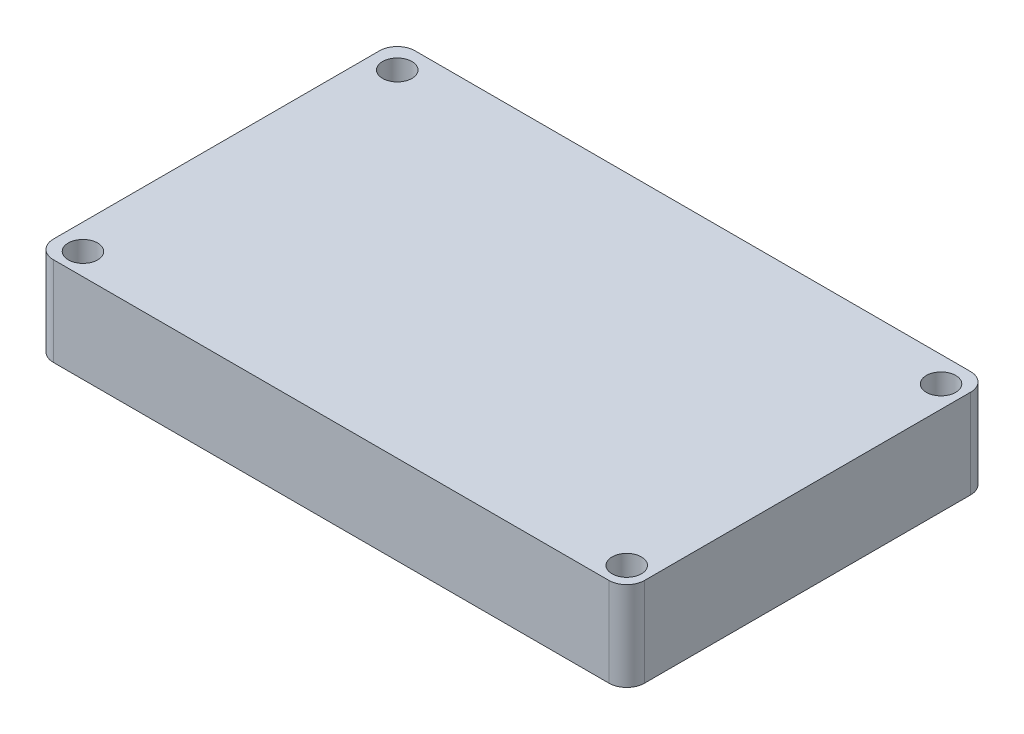
ISO-10303-21;
HEADER;
FILE_DESCRIPTION(('STEP AP214'),'2;1');
FILE_NAME('part.step','',(''),(''),'','','');
FILE_SCHEMA(('AUTOMOTIVE_DESIGN { 1 0 10303 214 1 1 1 1 }'));
ENDSEC;
DATA;
#1=APPLICATION_CONTEXT('core data for automotive mechanical design processes');
#2=APPLICATION_PROTOCOL_DEFINITION('international standard','automotive_design',2000,#1);
#3=PRODUCT_CONTEXT('',#1,'mechanical');
#4=PRODUCT('Part','Part','',(#3));
#5=PRODUCT_RELATED_PRODUCT_CATEGORY('part','',(#4));
#6=PRODUCT_DEFINITION_FORMATION('','',#4);
#7=PRODUCT_DEFINITION_CONTEXT('part definition',#1,'design');
#8=PRODUCT_DEFINITION('design','',#6,#7);
#9=PRODUCT_DEFINITION_SHAPE('','',#8);
#10=(LENGTH_UNIT() NAMED_UNIT(*) SI_UNIT(.MILLI.,.METRE.));
#11=(NAMED_UNIT(*) PLANE_ANGLE_UNIT() SI_UNIT($,.RADIAN.));
#12=(NAMED_UNIT(*) SI_UNIT($,.STERADIAN.) SOLID_ANGLE_UNIT());
#13=UNCERTAINTY_MEASURE_WITH_UNIT(LENGTH_MEASURE(1.E-05),#10,'distance_accuracy_value','');
#14=(GEOMETRIC_REPRESENTATION_CONTEXT(3) GLOBAL_UNCERTAINTY_ASSIGNED_CONTEXT((#13)) GLOBAL_UNIT_ASSIGNED_CONTEXT((#10,
#11,#12)) REPRESENTATION_CONTEXT('',''));
#15=CARTESIAN_POINT('',(0.,0.,0.));
#16=DIRECTION('',(0.,0.,1.));
#17=DIRECTION('',(1.,0.,0.));
#18=AXIS2_PLACEMENT_3D('',#15,#16,#17);
#19=CARTESIAN_POINT('',(0.,10.,0.));
#20=DIRECTION('',(1.,0.,0.));
#21=DIRECTION('',(0.,0.,-1.));
#22=AXIS2_PLACEMENT_3D('',#19,#20,#21);
#23=PLANE('',#22);
#24=DIRECTION('',(0.,0.,1.));
#25=VECTOR('',#24,1.);
#26=CARTESIAN_POINT('',(0.,0.,0.));
#27=LINE('',#26,#25);
#28=CARTESIAN_POINT('',(0.,0.,-38.64));
#29=VERTEX_POINT('',#28);
#30=CARTESIAN_POINT('',(0.,0.,-2.));
#31=VERTEX_POINT('',#30);
#32=EDGE_CURVE('E128',#29,#31,#27,.T.);
#33=ORIENTED_EDGE('',*,*,#32,.T.);
#34=DIRECTION('',(0.,-1.,0.));
#35=VECTOR('',#34,1.);
#36=CARTESIAN_POINT('',(0.,10.,-2.));
#37=LINE('',#36,#35);
#38=CARTESIAN_POINT('',(0.,10.,-2.));
#39=VERTEX_POINT('',#38);
#40=EDGE_CURVE('E106',#31,#39,#37,.F.);
#41=ORIENTED_EDGE('',*,*,#40,.T.);
#42=DIRECTION('',(0.,0.,1.));
#43=VECTOR('',#42,1.);
#44=CARTESIAN_POINT('',(0.,10.,0.));
#45=LINE('',#44,#43);
#46=CARTESIAN_POINT('',(0.,10.,-38.64));
#47=VERTEX_POINT('',#46);
#48=EDGE_CURVE('E138',#47,#39,#45,.T.);
#49=ORIENTED_EDGE('',*,*,#48,.F.);
#50=DIRECTION('',(0.,-1.,0.));
#51=VECTOR('',#50,1.);
#52=CARTESIAN_POINT('',(0.,10.,-38.64));
#53=LINE('',#52,#51);
#54=EDGE_CURVE('E111',#47,#29,#53,.T.);
#55=ORIENTED_EDGE('',*,*,#54,.T.);
#56=EDGE_LOOP('',(#33,#41,#49,#55));
#57=FACE_BOUND('',#56,.T.);
#58=ADVANCED_FACE('F35',(#57),#23,.F.);
#59=CARTESIAN_POINT('',(0.,10.,0.));
#60=DIRECTION('',(0.,0.,-1.));
#61=DIRECTION('',(-1.,0.,0.));
#62=AXIS2_PLACEMENT_3D('',#59,#60,#61);
#63=PLANE('',#62);
#64=DIRECTION('',(1.,0.,0.));
#65=VECTOR('',#64,1.);
#66=CARTESIAN_POINT('',(0.,10.,0.));
#67=LINE('',#66,#65);
#68=CARTESIAN_POINT('',(2.,10.,0.));
#69=VERTEX_POINT('',#68);
#70=CARTESIAN_POINT('',(64.42,10.,0.));
#71=VERTEX_POINT('',#70);
#72=EDGE_CURVE('E121',#69,#71,#67,.T.);
#73=ORIENTED_EDGE('',*,*,#72,.F.);
#74=DIRECTION('',(0.,-1.,0.));
#75=VECTOR('',#74,1.);
#76=CARTESIAN_POINT('',(2.,10.,0.));
#77=LINE('',#76,#75);
#78=CARTESIAN_POINT('',(2.,0.,0.));
#79=VERTEX_POINT('',#78);
#80=EDGE_CURVE('E105',#69,#79,#77,.T.);
#81=ORIENTED_EDGE('',*,*,#80,.T.);
#82=DIRECTION('',(1.,0.,0.));
#83=VECTOR('',#82,1.);
#84=CARTESIAN_POINT('',(0.,0.,0.));
#85=LINE('',#84,#83);
#86=CARTESIAN_POINT('',(64.42,0.,0.));
#87=VERTEX_POINT('',#86);
#88=EDGE_CURVE('E118',#79,#87,#85,.T.);
#89=ORIENTED_EDGE('',*,*,#88,.T.);
#90=DIRECTION('',(0.,-1.,0.));
#91=VECTOR('',#90,1.);
#92=CARTESIAN_POINT('',(64.42,10.,0.));
#93=LINE('',#92,#91);
#94=EDGE_CURVE('E123',#87,#71,#93,.F.);
#95=ORIENTED_EDGE('',*,*,#94,.T.);
#96=EDGE_LOOP('',(#73,#81,#89,#95));
#97=FACE_BOUND('',#96,.T.);
#98=ADVANCED_FACE('F117',(#97),#63,.F.);
#99=CARTESIAN_POINT('',(66.42,10.,0.));
#100=DIRECTION('',(-1.,0.,0.));
#101=DIRECTION('',(0.,0.,1.));
#102=AXIS2_PLACEMENT_3D('',#99,#100,#101);
#103=PLANE('',#102);
#104=DIRECTION('',(0.,0.,-1.));
#105=VECTOR('',#104,1.);
#106=CARTESIAN_POINT('',(66.42,0.,0.));
#107=LINE('',#106,#105);
#108=CARTESIAN_POINT('',(66.42,0.,-2.));
#109=VERTEX_POINT('',#108);
#110=CARTESIAN_POINT('',(66.42,0.,-38.64));
#111=VERTEX_POINT('',#110);
#112=EDGE_CURVE('E127',#109,#111,#107,.T.);
#113=ORIENTED_EDGE('',*,*,#112,.T.);
#114=DIRECTION('',(0.,-1.,0.));
#115=VECTOR('',#114,1.);
#116=CARTESIAN_POINT('',(66.42,10.,-38.64));
#117=LINE('',#116,#115);
#118=CARTESIAN_POINT('',(66.42,10.,-38.64));
#119=VERTEX_POINT('',#118);
#120=EDGE_CURVE('E11',#111,#119,#117,.F.);
#121=ORIENTED_EDGE('',*,*,#120,.T.);
#122=DIRECTION('',(0.,0.,-1.));
#123=VECTOR('',#122,1.);
#124=CARTESIAN_POINT('',(66.42,10.,0.));
#125=LINE('',#124,#123);
#126=CARTESIAN_POINT('',(66.42,10.,-2.));
#127=VERTEX_POINT('',#126);
#128=EDGE_CURVE('E164',#127,#119,#125,.T.);
#129=ORIENTED_EDGE('',*,*,#128,.F.);
#130=DIRECTION('',(0.,-1.,0.));
#131=VECTOR('',#130,1.);
#132=CARTESIAN_POINT('',(66.42,10.,-2.));
#133=LINE('',#132,#131);
#134=EDGE_CURVE('E43',#127,#109,#133,.T.);
#135=ORIENTED_EDGE('',*,*,#134,.T.);
#136=EDGE_LOOP('',(#113,#121,#129,#135));
#137=FACE_BOUND('',#136,.T.);
#138=ADVANCED_FACE('F162',(#137),#103,.F.);
#139=CARTESIAN_POINT('',(0.,10.,-40.64));
#140=DIRECTION('',(0.,0.,1.));
#141=DIRECTION('',(1.,0.,0.));
#142=AXIS2_PLACEMENT_3D('',#139,#140,#141);
#143=PLANE('',#142);
#144=DIRECTION('',(-1.,0.,0.));
#145=VECTOR('',#144,1.);
#146=CARTESIAN_POINT('',(0.,0.,-40.64));
#147=LINE('',#146,#145);
#148=CARTESIAN_POINT('',(64.42,0.,-40.64));
#149=VERTEX_POINT('',#148);
#150=CARTESIAN_POINT('',(2.,0.,-40.64));
#151=VERTEX_POINT('',#150);
#152=EDGE_CURVE('E131',#149,#151,#147,.T.);
#153=ORIENTED_EDGE('',*,*,#152,.T.);
#154=DIRECTION('',(0.,-1.,0.));
#155=VECTOR('',#154,1.);
#156=CARTESIAN_POINT('',(2.,10.,-40.64));
#157=LINE('',#156,#155);
#158=CARTESIAN_POINT('',(2.,10.,-40.64));
#159=VERTEX_POINT('',#158);
#160=EDGE_CURVE('E50',#151,#159,#157,.F.);
#161=ORIENTED_EDGE('',*,*,#160,.T.);
#162=DIRECTION('',(-1.,0.,0.));
#163=VECTOR('',#162,1.);
#164=CARTESIAN_POINT('',(0.,10.,-40.64));
#165=LINE('',#164,#163);
#166=CARTESIAN_POINT('',(64.42,10.,-40.64));
#167=VERTEX_POINT('',#166);
#168=EDGE_CURVE('E139',#167,#159,#165,.T.);
#169=ORIENTED_EDGE('',*,*,#168,.F.);
#170=DIRECTION('',(0.,-1.,0.));
#171=VECTOR('',#170,1.);
#172=CARTESIAN_POINT('',(64.42,10.,-40.64));
#173=LINE('',#172,#171);
#174=EDGE_CURVE('E155',#167,#149,#173,.T.);
#175=ORIENTED_EDGE('',*,*,#174,.T.);
#176=EDGE_LOOP('',(#153,#161,#169,#175));
#177=FACE_BOUND('',#176,.T.);
#178=ADVANCED_FACE('F171',(#177),#143,.F.);
#179=CARTESIAN_POINT('',(0.,10.,0.));
#180=DIRECTION('',(0.,-1.,0.));
#181=DIRECTION('',(0.,0.,-1.));
#182=AXIS2_PLACEMENT_3D('',#179,#180,#181);
#183=PLANE('',#182);
#184=CARTESIAN_POINT('',(2.86500000000001,10.,-2.465));
#185=DIRECTION('',(0.,1.,0.));
#186=DIRECTION('',(0.,0.,1.));
#187=AXIS2_PLACEMENT_3D('',#184,#185,#186);
#188=CIRCLE('',#187,1.65);
#189=CARTESIAN_POINT('',(2.86500000000001,10.,-0.814999999999999));
#190=VERTEX_POINT('',#189);
#191=EDGE_CURVE('E198',#190,#190,#188,.T.);
#192=ORIENTED_EDGE('',*,*,#191,.F.);
#193=EDGE_LOOP('',(#192));
#194=FACE_BOUND('',#193,.T.);
#195=CARTESIAN_POINT('',(2.86500000000001,10.,-37.775));
#196=DIRECTION('',(0.,1.,0.));
#197=DIRECTION('',(0.,0.,1.));
#198=AXIS2_PLACEMENT_3D('',#195,#196,#197);
#199=CIRCLE('',#198,1.65);
#200=CARTESIAN_POINT('',(2.86500000000001,10.,-36.125));
#201=VERTEX_POINT('',#200);
#202=EDGE_CURVE('E192',#201,#201,#199,.T.);
#203=ORIENTED_EDGE('',*,*,#202,.F.);
#204=EDGE_LOOP('',(#203));
#205=FACE_BOUND('',#204,.T.);
#206=CARTESIAN_POINT('',(63.955,10.,-37.775));
#207=DIRECTION('',(0.,1.,0.));
#208=DIRECTION('',(0.,0.,1.));
#209=AXIS2_PLACEMENT_3D('',#206,#207,#208);
#210=CIRCLE('',#209,1.65);
#211=CARTESIAN_POINT('',(63.955,10.,-36.125));
#212=VERTEX_POINT('',#211);
#213=EDGE_CURVE('E186',#212,#212,#210,.T.);
#214=ORIENTED_EDGE('',*,*,#213,.F.);
#215=EDGE_LOOP('',(#214));
#216=FACE_BOUND('',#215,.T.);
#217=CARTESIAN_POINT('',(63.955,10.,-2.465));
#218=DIRECTION('',(0.,1.,0.));
#219=DIRECTION('',(0.,0.,1.));
#220=AXIS2_PLACEMENT_3D('',#217,#218,#219);
#221=CIRCLE('',#220,1.65);
#222=CARTESIAN_POINT('',(63.955,10.,-0.814999999999998));
#223=VERTEX_POINT('',#222);
#224=EDGE_CURVE('E180',#223,#223,#221,.T.);
#225=ORIENTED_EDGE('',*,*,#224,.F.);
#226=EDGE_LOOP('',(#225));
#227=FACE_BOUND('',#226,.T.);
#228=ORIENTED_EDGE('',*,*,#48,.T.);
#229=CARTESIAN_POINT('',(2.,10.,-2.));
#230=DIRECTION('',(0.,-1.,0.));
#231=DIRECTION('',(0.,0.,-1.));
#232=AXIS2_PLACEMENT_3D('',#229,#230,#231);
#233=CIRCLE('',#232,2.);
#234=EDGE_CURVE('E153',#39,#69,#233,.F.);
#235=ORIENTED_EDGE('',*,*,#234,.T.);
#236=ORIENTED_EDGE('',*,*,#72,.T.);
#237=CARTESIAN_POINT('',(64.42,10.,-2.));
#238=DIRECTION('',(0.,-1.,0.));
#239=DIRECTION('',(0.,0.,-1.));
#240=AXIS2_PLACEMENT_3D('',#237,#238,#239);
#241=CIRCLE('',#240,2.);
#242=EDGE_CURVE('E148',#71,#127,#241,.F.);
#243=ORIENTED_EDGE('',*,*,#242,.T.);
#244=ORIENTED_EDGE('',*,*,#128,.T.);
#245=CARTESIAN_POINT('',(64.42,10.,-38.64));
#246=DIRECTION('',(0.,-1.,0.));
#247=DIRECTION('',(0.,0.,-1.));
#248=AXIS2_PLACEMENT_3D('',#245,#246,#247);
#249=CIRCLE('',#248,2.);
#250=EDGE_CURVE('E57',#119,#167,#249,.F.);
#251=ORIENTED_EDGE('',*,*,#250,.T.);
#252=ORIENTED_EDGE('',*,*,#168,.T.);
#253=CARTESIAN_POINT('',(2.,10.,-38.64));
#254=DIRECTION('',(0.,-1.,0.));
#255=DIRECTION('',(0.,0.,-1.));
#256=AXIS2_PLACEMENT_3D('',#253,#254,#255);
#257=CIRCLE('',#256,2.);
#258=EDGE_CURVE('E151',#159,#47,#257,.F.);
#259=ORIENTED_EDGE('',*,*,#258,.T.);
#260=EDGE_LOOP('',(#228,#235,#236,#243,#244,#251,#252,#259));
#261=FACE_BOUND('',#260,.T.);
#262=ADVANCED_FACE('F205',(#194,#205,#216,#227,#261),#183,.F.);
#263=CARTESIAN_POINT('',(0.,0.,0.));
#264=DIRECTION('',(0.,-1.,0.));
#265=DIRECTION('',(0.,0.,-1.));
#266=AXIS2_PLACEMENT_3D('',#263,#264,#265);
#267=PLANE('',#266);
#268=CARTESIAN_POINT('',(2.86500000000001,0.,-2.465));
#269=DIRECTION('',(0.,-1.,0.));
#270=DIRECTION('',(0.,0.,-1.));
#271=AXIS2_PLACEMENT_3D('',#268,#269,#270);
#272=CIRCLE('',#271,1.65);
#273=CARTESIAN_POINT('',(2.86500000000001,0.,-4.115));
#274=VERTEX_POINT('',#273);
#275=EDGE_CURVE('E195',#274,#274,#272,.F.);
#276=ORIENTED_EDGE('',*,*,#275,.T.);
#277=EDGE_LOOP('',(#276));
#278=FACE_BOUND('',#277,.T.);
#279=CARTESIAN_POINT('',(2.86500000000001,0.,-37.775));
#280=DIRECTION('',(0.,-1.,0.));
#281=DIRECTION('',(0.,0.,-1.));
#282=AXIS2_PLACEMENT_3D('',#279,#280,#281);
#283=CIRCLE('',#282,1.65);
#284=CARTESIAN_POINT('',(2.86500000000001,0.,-39.425));
#285=VERTEX_POINT('',#284);
#286=EDGE_CURVE('E189',#285,#285,#283,.F.);
#287=ORIENTED_EDGE('',*,*,#286,.T.);
#288=EDGE_LOOP('',(#287));
#289=FACE_BOUND('',#288,.T.);
#290=CARTESIAN_POINT('',(63.955,0.,-37.775));
#291=DIRECTION('',(0.,-1.,0.));
#292=DIRECTION('',(0.,0.,-1.));
#293=AXIS2_PLACEMENT_3D('',#290,#291,#292);
#294=CIRCLE('',#293,1.65);
#295=CARTESIAN_POINT('',(63.955,0.,-39.425));
#296=VERTEX_POINT('',#295);
#297=EDGE_CURVE('E183',#296,#296,#294,.F.);
#298=ORIENTED_EDGE('',*,*,#297,.T.);
#299=EDGE_LOOP('',(#298));
#300=FACE_BOUND('',#299,.T.);
#301=CARTESIAN_POINT('',(63.955,0.,-2.465));
#302=DIRECTION('',(0.,-1.,0.));
#303=DIRECTION('',(0.,0.,-1.));
#304=AXIS2_PLACEMENT_3D('',#301,#302,#303);
#305=CIRCLE('',#304,1.65);
#306=CARTESIAN_POINT('',(63.955,0.,-4.115));
#307=VERTEX_POINT('',#306);
#308=EDGE_CURVE('E133',#307,#307,#305,.F.);
#309=ORIENTED_EDGE('',*,*,#308,.T.);
#310=EDGE_LOOP('',(#309));
#311=FACE_BOUND('',#310,.T.);
#312=ORIENTED_EDGE('',*,*,#88,.F.);
#313=CARTESIAN_POINT('',(2.,0.,-2.));
#314=DIRECTION('',(0.,-1.,0.));
#315=DIRECTION('',(0.,0.,-1.));
#316=AXIS2_PLACEMENT_3D('',#313,#314,#315);
#317=CIRCLE('',#316,2.);
#318=EDGE_CURVE('E101',#79,#31,#317,.T.);
#319=ORIENTED_EDGE('',*,*,#318,.T.);
#320=ORIENTED_EDGE('',*,*,#32,.F.);
#321=CARTESIAN_POINT('',(2.,0.,-38.64));
#322=DIRECTION('',(0.,-1.,0.));
#323=DIRECTION('',(0.,0.,-1.));
#324=AXIS2_PLACEMENT_3D('',#321,#322,#323);
#325=CIRCLE('',#324,2.);
#326=EDGE_CURVE('E112',#29,#151,#325,.T.);
#327=ORIENTED_EDGE('',*,*,#326,.T.);
#328=ORIENTED_EDGE('',*,*,#152,.F.);
#329=CARTESIAN_POINT('',(64.42,0.,-38.64));
#330=DIRECTION('',(0.,-1.,0.));
#331=DIRECTION('',(0.,0.,-1.));
#332=AXIS2_PLACEMENT_3D('',#329,#330,#331);
#333=CIRCLE('',#332,2.);
#334=EDGE_CURVE('E142',#149,#111,#333,.T.);
#335=ORIENTED_EDGE('',*,*,#334,.T.);
#336=ORIENTED_EDGE('',*,*,#112,.F.);
#337=CARTESIAN_POINT('',(64.42,0.,-2.));
#338=DIRECTION('',(0.,-1.,0.));
#339=DIRECTION('',(0.,0.,-1.));
#340=AXIS2_PLACEMENT_3D('',#337,#338,#339);
#341=CIRCLE('',#340,2.);
#342=EDGE_CURVE('E122',#109,#87,#341,.T.);
#343=ORIENTED_EDGE('',*,*,#342,.T.);
#344=EDGE_LOOP('',(#312,#319,#320,#327,#328,#335,#336,#343));
#345=FACE_BOUND('',#344,.T.);
#346=ADVANCED_FACE('F125',(#278,#289,#300,#311,#345),#267,.T.);
#347=CARTESIAN_POINT('',(63.955,-4.66690475583122,-2.465));
#348=DIRECTION('',(0.,1.,0.));
#349=DIRECTION('',(0.,0.,1.));
#350=AXIS2_PLACEMENT_3D('',#347,#348,#349);
#351=CYLINDRICAL_SURFACE('',#350,1.65);
#352=ORIENTED_EDGE('',*,*,#224,.T.);
#353=EDGE_LOOP('',(#352));
#354=FACE_BOUND('',#353,.T.);
#355=ORIENTED_EDGE('',*,*,#308,.F.);
#356=EDGE_LOOP('',(#355));
#357=FACE_BOUND('',#356,.T.);
#358=ADVANCED_FACE('F238',(#354,#357),#351,.F.);
#359=CARTESIAN_POINT('',(63.955,-4.66690475583122,-37.775));
#360=DIRECTION('',(0.,1.,0.));
#361=DIRECTION('',(0.,0.,1.));
#362=AXIS2_PLACEMENT_3D('',#359,#360,#361);
#363=CYLINDRICAL_SURFACE('',#362,1.65);
#364=ORIENTED_EDGE('',*,*,#213,.T.);
#365=EDGE_LOOP('',(#364));
#366=FACE_BOUND('',#365,.T.);
#367=ORIENTED_EDGE('',*,*,#297,.F.);
#368=EDGE_LOOP('',(#367));
#369=FACE_BOUND('',#368,.T.);
#370=ADVANCED_FACE('F243',(#366,#369),#363,.F.);
#371=CARTESIAN_POINT('',(2.86500000000001,-4.66690475583122,-37.775));
#372=DIRECTION('',(0.,1.,0.));
#373=DIRECTION('',(0.,0.,1.));
#374=AXIS2_PLACEMENT_3D('',#371,#372,#373);
#375=CYLINDRICAL_SURFACE('',#374,1.65);
#376=ORIENTED_EDGE('',*,*,#202,.T.);
#377=EDGE_LOOP('',(#376));
#378=FACE_BOUND('',#377,.T.);
#379=ORIENTED_EDGE('',*,*,#286,.F.);
#380=EDGE_LOOP('',(#379));
#381=FACE_BOUND('',#380,.T.);
#382=ADVANCED_FACE('F247',(#378,#381),#375,.F.);
#383=CARTESIAN_POINT('',(2.86500000000001,-4.66690475583122,-2.465));
#384=DIRECTION('',(0.,1.,0.));
#385=DIRECTION('',(0.,0.,1.));
#386=AXIS2_PLACEMENT_3D('',#383,#384,#385);
#387=CYLINDRICAL_SURFACE('',#386,1.65);
#388=ORIENTED_EDGE('',*,*,#191,.T.);
#389=EDGE_LOOP('',(#388));
#390=FACE_BOUND('',#389,.T.);
#391=ORIENTED_EDGE('',*,*,#275,.F.);
#392=EDGE_LOOP('',(#391));
#393=FACE_BOUND('',#392,.T.);
#394=ADVANCED_FACE('F202',(#390,#393),#387,.F.);
#395=CARTESIAN_POINT('',(2.,10.,-2.));
#396=DIRECTION('',(0.,-1.,0.));
#397=DIRECTION('',(0.,0.,-1.));
#398=AXIS2_PLACEMENT_3D('',#395,#396,#397);
#399=CYLINDRICAL_SURFACE('',#398,2.);
#400=ORIENTED_EDGE('',*,*,#234,.F.);
#401=ORIENTED_EDGE('',*,*,#40,.F.);
#402=ORIENTED_EDGE('',*,*,#318,.F.);
#403=ORIENTED_EDGE('',*,*,#80,.F.);
#404=EDGE_LOOP('',(#400,#401,#402,#403));
#405=FACE_BOUND('',#404,.T.);
#406=ADVANCED_FACE('F104',(#405),#399,.T.);
#407=CARTESIAN_POINT('',(2.,10.,-38.64));
#408=DIRECTION('',(0.,-1.,0.));
#409=DIRECTION('',(0.,0.,-1.));
#410=AXIS2_PLACEMENT_3D('',#407,#408,#409);
#411=CYLINDRICAL_SURFACE('',#410,2.);
#412=ORIENTED_EDGE('',*,*,#258,.F.);
#413=ORIENTED_EDGE('',*,*,#160,.F.);
#414=ORIENTED_EDGE('',*,*,#326,.F.);
#415=ORIENTED_EDGE('',*,*,#54,.F.);
#416=EDGE_LOOP('',(#412,#413,#414,#415));
#417=FACE_BOUND('',#416,.T.);
#418=ADVANCED_FACE('F218',(#417),#411,.T.);
#419=CARTESIAN_POINT('',(64.42,10.,-38.64));
#420=DIRECTION('',(0.,-1.,0.));
#421=DIRECTION('',(0.,0.,-1.));
#422=AXIS2_PLACEMENT_3D('',#419,#420,#421);
#423=CYLINDRICAL_SURFACE('',#422,2.);
#424=ORIENTED_EDGE('',*,*,#250,.F.);
#425=ORIENTED_EDGE('',*,*,#120,.F.);
#426=ORIENTED_EDGE('',*,*,#334,.F.);
#427=ORIENTED_EDGE('',*,*,#174,.F.);
#428=EDGE_LOOP('',(#424,#425,#426,#427));
#429=FACE_BOUND('',#428,.T.);
#430=ADVANCED_FACE('F170',(#429),#423,.T.);
#431=CARTESIAN_POINT('',(64.42,10.,-2.));
#432=DIRECTION('',(0.,-1.,0.));
#433=DIRECTION('',(0.,0.,-1.));
#434=AXIS2_PLACEMENT_3D('',#431,#432,#433);
#435=CYLINDRICAL_SURFACE('',#434,2.);
#436=ORIENTED_EDGE('',*,*,#242,.F.);
#437=ORIENTED_EDGE('',*,*,#94,.F.);
#438=ORIENTED_EDGE('',*,*,#342,.F.);
#439=ORIENTED_EDGE('',*,*,#134,.F.);
#440=EDGE_LOOP('',(#436,#437,#438,#439));
#441=FACE_BOUND('',#440,.T.);
#442=ADVANCED_FACE('F37',(#441),#435,.T.);
#443=CLOSED_SHELL('',(#58,#98,#138,#178,#262,#346,#358,#370,#382,#394,#406,#418,#430,#442));
#444=MANIFOLD_SOLID_BREP('B2',#443);
#445=ADVANCED_BREP_SHAPE_REPRESENTATION('',(#18,#444),#14);
#446=SHAPE_DEFINITION_REPRESENTATION(#9,#445);
ENDSEC;
END-ISO-10303-21;
